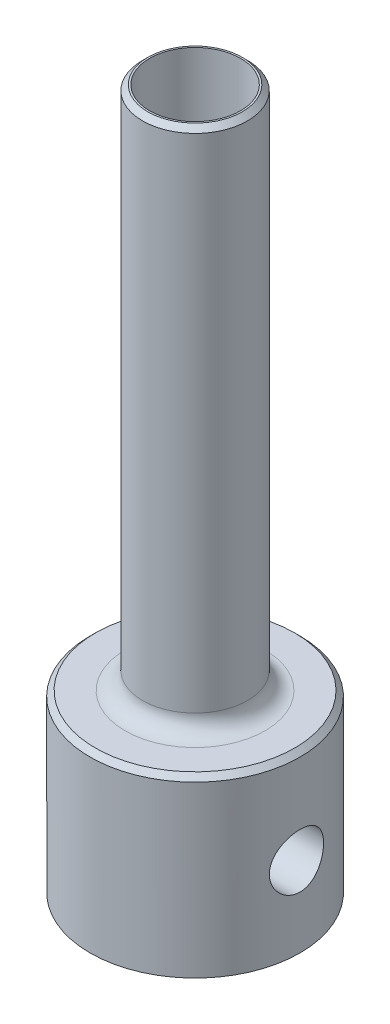
ISO-10303-21;
HEADER;
FILE_DESCRIPTION(('STEP AP214'),'2;1');
FILE_NAME('part.step','',(''),(''),'','','');
FILE_SCHEMA(('AUTOMOTIVE_DESIGN { 1 0 10303 214 1 1 1 1 }'));
ENDSEC;
DATA;
#1=APPLICATION_CONTEXT('core data for automotive mechanical design processes');
#2=APPLICATION_PROTOCOL_DEFINITION('international standard','automotive_design',2000,#1);
#3=PRODUCT_CONTEXT('',#1,'mechanical');
#4=PRODUCT('Part','Part','',(#3));
#5=PRODUCT_RELATED_PRODUCT_CATEGORY('part','',(#4));
#6=PRODUCT_DEFINITION_FORMATION('','',#4);
#7=PRODUCT_DEFINITION_CONTEXT('part definition',#1,'design');
#8=PRODUCT_DEFINITION('design','',#6,#7);
#9=PRODUCT_DEFINITION_SHAPE('','',#8);
#10=(LENGTH_UNIT() NAMED_UNIT(*) SI_UNIT(.MILLI.,.METRE.));
#11=(NAMED_UNIT(*) PLANE_ANGLE_UNIT() SI_UNIT($,.RADIAN.));
#12=(NAMED_UNIT(*) SI_UNIT($,.STERADIAN.) SOLID_ANGLE_UNIT());
#13=UNCERTAINTY_MEASURE_WITH_UNIT(LENGTH_MEASURE(1.E-05),#10,'distance_accuracy_value','');
#14=(GEOMETRIC_REPRESENTATION_CONTEXT(3) GLOBAL_UNCERTAINTY_ASSIGNED_CONTEXT((#13)) GLOBAL_UNIT_ASSIGNED_CONTEXT((#10,
#11,#12)) REPRESENTATION_CONTEXT('',''));
#15=CARTESIAN_POINT('',(0.,0.,0.));
#16=DIRECTION('',(0.,0.,1.));
#17=DIRECTION('',(1.,0.,0.));
#18=AXIS2_PLACEMENT_3D('',#15,#16,#17);
#19=CARTESIAN_POINT('',(6.,4.56706046867482,0.));
#20=DIRECTION('',(-1.,0.,0.));
#21=DIRECTION('',(0.,0.,1.));
#22=AXIS2_PLACEMENT_3D('',#19,#20,#21);
#23=CYLINDRICAL_SURFACE('',#22,1.55);
#24=CARTESIAN_POINT('',(2.08746257451481,4.56706046867482,1.55));
#25=CARTESIAN_POINT('',(2.08745806530159,4.64517581261313,1.55000318983942));
#26=CARTESIAN_POINT('',(2.09191273201824,4.72327534359271,1.54405895301082));
#27=CARTESIAN_POINT('',(2.1089405749611,4.87685905117993,1.52071371002282));
#28=CARTESIAN_POINT('',(2.12152214035706,4.95234044021821,1.50330086477498));
#29=CARTESIAN_POINT('',(2.15278493454552,5.09813246542977,1.45816823322694));
#30=CARTESIAN_POINT('',(2.17142267546406,5.16847571210937,1.43052174081689));
#31=CARTESIAN_POINT('',(2.21261714468958,5.30348121435537,1.36593939264584));
#32=CARTESIAN_POINT('',(2.23517507046234,5.36814172495066,1.32900069692648));
#33=CARTESIAN_POINT('',(2.28495532031077,5.49849954526781,1.24169043633872));
#34=CARTESIAN_POINT('',(2.31241213534774,5.56338248241716,1.19023643904052));
#35=CARTESIAN_POINT('',(2.36701387939925,5.68427289170583,1.07757576447372));
#36=CARTESIAN_POINT('',(2.39415856368944,5.74027378864133,1.01636192878333));
#37=CARTESIAN_POINT('',(2.44849706108598,5.84768812727782,0.878035332538123));
#38=CARTESIAN_POINT('',(2.47539022808828,5.8979836034672,0.799924647925211));
#39=CARTESIAN_POINT('',(2.52286864368294,5.98433524287479,0.634442213538337));
#40=CARTESIAN_POINT('',(2.5434595955574,6.0204042890956,0.547078934003073));
#41=CARTESIAN_POINT('',(2.57426922435814,6.07364120240378,0.374293501243633));
#42=CARTESIAN_POINT('',(2.58528419446998,6.09227311702322,0.289468077507183));
#43=CARTESIAN_POINT('',(2.5987854524458,6.11505105033185,0.11725288413592));
#44=CARTESIAN_POINT('',(2.60127961711166,6.11921044776936,0.0298655582028385));
#45=CARTESIAN_POINT('',(2.59769891031333,6.11319705048243,-0.133452683297385));
#46=CARTESIAN_POINT('',(2.59263599679387,6.10471699545807,-0.209476054323791));
#47=CARTESIAN_POINT('',(2.57622032330329,6.07687431216239,-0.358788270076783));
#48=CARTESIAN_POINT('',(2.56486709802934,6.05751087883139,-0.432076912083671));
#49=CARTESIAN_POINT('',(2.53676589486469,6.00861605985175,-0.574571536689056));
#50=CARTESIAN_POINT('',(2.51998461378551,5.97902182519784,-0.643749111781435));
#51=CARTESIAN_POINT('',(2.48237632002971,5.91075056165637,-0.776245638879004));
#52=CARTESIAN_POINT('',(2.46154823721762,5.87207112971454,-0.839563034666581));
#53=CARTESIAN_POINT('',(2.41470656143321,5.78154986314299,-0.966592034038011));
#54=CARTESIAN_POINT('',(2.38837092798848,5.7286909339586,-1.02945941506711));
#55=CARTESIAN_POINT('',(2.33471287452645,5.61394094799711,-1.14596684937295));
#56=CARTESIAN_POINT('',(2.30738917365759,5.55203782634899,-1.19959436518265));
#57=CARTESIAN_POINT('',(2.2512065830306,5.41261429109983,-1.30225354860711));
#58=CARTESIAN_POINT('',(2.22252618133082,5.33411851954438,-1.35007008223513));
#59=CARTESIAN_POINT('',(2.17093652653093,5.16840102430859,-1.43156349865217));
#60=CARTESIAN_POINT('',(2.14801670542844,5.08119569563776,-1.46526635035277));
#61=CARTESIAN_POINT('',(2.11644259300121,4.92245710350699,-1.51037550701403));
#62=CARTESIAN_POINT('',(2.1056684460474,4.85232371456737,-1.52522252544559));
#63=CARTESIAN_POINT('',(2.09115774059389,4.70999120665968,-1.54506246807911));
#64=CARTESIAN_POINT('',(2.08741320391957,4.63779452403593,-1.55006656370072));
#65=CARTESIAN_POINT('',(2.08751302036696,4.49332796578692,-1.54993198810319));
#66=CARTESIAN_POINT('',(2.09136697020823,4.42105811297075,-1.54478049059661));
#67=CARTESIAN_POINT('',(2.10610081306986,4.27862547032371,-1.52462730206621));
#68=CARTESIAN_POINT('',(2.11698620673201,4.20846437516587,-1.50961789912821));
#69=CARTESIAN_POINT('',(2.14434666184983,4.07186628230976,-1.47048984579238));
#70=CARTESIAN_POINT('',(2.16082634018672,4.00543241357685,-1.44636366958811));
#71=CARTESIAN_POINT('',(2.1976010774662,3.87733343636671,-1.38985043554067));
#72=CARTESIAN_POINT('',(2.21789759032559,3.8156701577879,-1.35746022806218));
#73=CARTESIAN_POINT('',(2.2643882102968,3.68719851226779,-1.27866735172455));
#74=CARTESIAN_POINT('',(2.29098832191621,3.62143677180769,-1.23079544073045));
#75=CARTESIAN_POINT('',(2.34454000954113,3.49820584473131,-1.12544671730584));
#76=CARTESIAN_POINT('',(2.37149189417325,3.44074456021763,-1.06796086318064));
#77=CARTESIAN_POINT('',(2.42671007046372,3.32847134803819,-0.936366294995754));
#78=CARTESIAN_POINT('',(2.45471577789731,3.27490021136597,-0.861076411110007));
#79=CARTESIAN_POINT('',(2.50519003473271,3.18141086155145,-0.700760441538226));
#80=CARTESIAN_POINT('',(2.52766237852491,3.14148328529197,-0.615741086564795));
#81=CARTESIAN_POINT('',(2.56303350772786,3.07970294229233,-0.444853565643398));
#82=CARTESIAN_POINT('',(2.57651901048577,3.05672868805645,-0.359516648655455));
#83=CARTESIAN_POINT('',(2.59486088471308,3.02564356958777,-0.185304462903781));
#84=CARTESIAN_POINT('',(2.59972671492911,3.01751641267397,-0.0964331822275583));
#85=CARTESIAN_POINT('',(2.60021701940269,3.0166985822596,0.0696974031075937));
#86=CARTESIAN_POINT('',(2.59696906461994,3.02212443813912,0.146952088376935));
#87=CARTESIAN_POINT('',(2.5838528722841,3.04427487857837,0.299236278104113));
#88=CARTESIAN_POINT('',(2.57398451620059,3.06099966543208,0.374265742696901));
#89=CARTESIAN_POINT('',(2.5486936517609,3.10464830952694,0.519137376139522));
#90=CARTESIAN_POINT('',(2.53334736693584,3.13143244867627,0.58903559661503));
#91=CARTESIAN_POINT('',(2.49831176992408,3.19420247854654,0.723369193616868));
#92=CARTESIAN_POINT('',(2.47862146061034,3.23019048222429,0.787803311204854));
#93=CARTESIAN_POINT('',(2.43400282482893,3.31474298831213,0.916946595240061));
#94=CARTESIAN_POINT('',(2.4087375171319,3.36425064518812,0.980920521598723));
#95=CARTESIAN_POINT('',(2.35667183778524,3.47223535145437,1.10015460920547));
#96=CARTESIAN_POINT('',(2.32986975464286,3.5307225277728,1.1554047874702));
#97=CARTESIAN_POINT('',(2.27372679196635,3.66351382732411,1.26264140573439));
#98=CARTESIAN_POINT('',(2.2444831335369,3.73887992854266,1.31337393335238));
#99=CARTESIAN_POINT('',(2.1905945675124,3.898606701965,1.4014162561131));
#100=CARTESIAN_POINT('',(2.16594645345186,3.98296103770681,1.43873542719969));
#101=CARTESIAN_POINT('',(2.12743359305814,4.14956134641682,1.49501637264561));
#102=CARTESIAN_POINT('',(2.11270187909245,4.23108050794286,1.51550636106639));
#103=CARTESIAN_POINT('',(2.09272806757731,4.3974306736217,1.54298328014767));
#104=CARTESIAN_POINT('',(2.08746746992226,4.48225488993317,1.5499965369649));
#105=CARTESIAN_POINT('',(2.08746257451481,4.56706046867482,1.55));
#106=B_SPLINE_CURVE_WITH_KNOTS('',3,(#24,#25,#26,#27,#28,#29,#30,#31,#32,#33,#34,#35,#36,#37,
#38,#39,#40,#41,#42,#43,#44,#45,#46,#47,#48,#49,#50,#51,#52,#53,#54,#55,#56,#57,#58,#59,#60,#61,
#62,#63,#64,#65,#66,#67,#68,#69,#70,#71,#72,#73,#74,#75,#76,#77,#78,#79,#80,#81,#82,#83,#84,#85,
#86,#87,#88,#89,#90,#91,#92,#93,#94,#95,#96,#97,#98,#99,#100,#101,#102,#103,#104,#105),
.UNSPECIFIED.,.T.,.F.,(4,2,2,2,2,2,2,2,2,2,2,2,2,2,2,2,2,2,2,2,2,2,2,2,2,2,2,2,2,2,2,2,2,2,2,2,
2,2,2,2,4),(0.,0.233990659873545,0.46822324859307,0.700809725276847,0.933467373469937,
1.19416698638042,1.45505869839772,1.74364404936739,2.03196746329298,2.29304451254287,
2.55388015157855,2.78277394347685,3.01168466921828,3.2420273712693,3.47243106820668,
3.73016624596823,3.98824843363916,4.27566389977332,4.5625481781735,4.7790925036228,
4.99539091567404,5.21196268280878,5.42870407780935,5.64562478293819,5.86262828595975,
6.11837069555862,6.37435499176225,6.6625142736021,6.95047540237001,7.21706594026688,
7.4833637549748,7.71476131793424,7.94616302390282,8.17446291585915,8.40281526637836,
8.65605269430457,8.90957784534476,9.19453536427606,9.47929330857837,9.73382195394626,
9.98785288218989),.UNSPECIFIED.);
#107=CARTESIAN_POINT('',(2.08746257451481,4.56706046867482,1.55));
#108=VERTEX_POINT('',#107);
#109=EDGE_CURVE('E110',#108,#108,#106,.T.);
#110=ORIENTED_EDGE('',*,*,#109,.T.);
#111=EDGE_LOOP('',(#110));
#112=FACE_BOUND('',#111,.T.);
#113=CARTESIAN_POINT('',(6.,3.01706046867483,0.));
#114=CARTESIAN_POINT('',(5.99999862342204,3.01706269335949,0.0855443503109015));
#115=CARTESIAN_POINT('',(5.99815242347884,3.02416603052848,0.171113037497965));
#116=CARTESIAN_POINT('',(5.99096665435731,3.05234534120872,0.33979179851728));
#117=CARTESIAN_POINT('',(5.98562525272891,3.07342864415661,0.422900558766312));
#118=CARTESIAN_POINT('',(5.97203960949649,3.12884151795694,0.584199755325658));
#119=CARTESIAN_POINT('',(5.9637989820615,3.16315460167539,0.662396172966988));
#120=CARTESIAN_POINT('',(5.94528918762444,3.24399346589979,0.811923659298572));
#121=CARTESIAN_POINT('',(5.93501991895733,3.29051985851235,0.88325438364906));
#122=CARTESIAN_POINT('',(5.91331349844705,3.39553949278338,1.01858610262265));
#123=CARTESIAN_POINT('',(5.90185736103427,3.45424994282367,1.08241550098619));
#124=CARTESIAN_POINT('',(5.87919241575865,3.58150643133549,1.19944035779268));
#125=CARTESIAN_POINT('',(5.86798363784996,3.65005365353798,1.25263453457501));
#126=CARTESIAN_POINT('',(5.84688974016224,3.7963886240304,1.34770055669256));
#127=CARTESIAN_POINT('',(5.83702865054471,3.87430659800901,1.38937776494719));
#128=CARTESIAN_POINT('',(5.82002464160501,4.03633918729534,1.45897413633046));
#129=CARTESIAN_POINT('',(5.81288125518578,4.12045273478852,1.48689566391888));
#130=CARTESIAN_POINT('',(5.80231702371196,4.29059517657796,1.52759748721533));
#131=CARTESIAN_POINT('',(5.7988201353963,4.37654512214238,1.54068759900813));
#132=CARTESIAN_POINT('',(5.79571741886674,4.54948675360122,1.55232047459679));
#133=CARTESIAN_POINT('',(5.79611091167847,4.63647825506971,1.55086577684598));
#134=CARTESIAN_POINT('',(5.80067628829122,4.80663776835577,1.53369691054171));
#135=CARTESIAN_POINT('',(5.80474960405351,4.88984637285412,1.51835471262771));
#136=CARTESIAN_POINT('',(5.81605821715439,5.05246662296708,1.47444090299209));
#137=CARTESIAN_POINT('',(5.82329375330479,5.13187798130994,1.44586829209606));
#138=CARTESIAN_POINT('',(5.84020013851927,5.28563323106378,1.3759946091883));
#139=CARTESIAN_POINT('',(5.84989618026752,5.35991391784646,1.33456080927768));
#140=CARTESIAN_POINT('',(5.87061719128373,5.50060028114337,1.24023361109786));
#141=CARTESIAN_POINT('',(5.88164240732856,5.5670044907426,1.18733808336582));
#142=CARTESIAN_POINT('',(5.90419219977471,5.69218143532656,1.06967440562533));
#143=CARTESIAN_POINT('',(5.91572174563884,5.7506593131412,1.0045931064851));
#144=CARTESIAN_POINT('',(5.93767843378634,5.85592917969273,0.865408013055353));
#145=CARTESIAN_POINT('',(5.94810553774123,5.90272076221032,0.791303905263335));
#146=CARTESIAN_POINT('',(5.9667402594753,5.98340861269976,0.635738370807675));
#147=CARTESIAN_POINT('',(5.97493913584994,6.01725429906115,0.554249593476176));
#148=CARTESIAN_POINT('',(5.98813025256303,6.0706826765574,0.386479280110456));
#149=CARTESIAN_POINT('',(5.99312314913482,6.0902682867032,0.300198728837418));
#150=CARTESIAN_POINT('',(5.99924157949929,6.11416401587934,0.127812754543027));
#151=CARTESIAN_POINT('',(6.00046866382196,6.11887534436704,0.0417664674608003));
#152=CARTESIAN_POINT('',(5.99920778898859,6.11399291602338,-0.129885864978109));
#153=CARTESIAN_POINT('',(5.99672018852505,6.10440054036766,-0.215491952039898));
#154=CARTESIAN_POINT('',(5.9883747898563,6.07151293542675,-0.382421044317187));
#155=CARTESIAN_POINT('',(5.98257145129857,6.04843899995326,-0.463790618710361));
#156=CARTESIAN_POINT('',(5.96825062497589,5.98949809840499,-0.621498146324932));
#157=CARTESIAN_POINT('',(5.95973285281969,5.9536297918168,-0.697835571316156));
#158=CARTESIAN_POINT('',(5.94068733069941,5.86935725083693,-0.844889791044561));
#159=CARTESIAN_POINT('',(5.93012502400678,5.82073147673446,-0.915475042399402));
#160=CARTESIAN_POINT('',(5.90821252780639,5.71260516322405,-1.04762556972084));
#161=CARTESIAN_POINT('',(5.89686219287224,5.65310261323924,-1.10918917423502));
#162=CARTESIAN_POINT('',(5.87428332425334,5.52304406222288,-1.2232207057171));
#163=CARTESIAN_POINT('',(5.86306587289093,5.45223820398516,-1.27540635258126));
#164=CARTESIAN_POINT('',(5.84235399256743,5.30264003275595,-1.36715789008128));
#165=CARTESIAN_POINT('',(5.83285948883467,5.22384806657319,-1.40672432841608));
#166=CARTESIAN_POINT('',(5.81677568825163,5.06092490657044,-1.47181700201492));
#167=CARTESIAN_POINT('',(5.81016933744992,4.97682850474033,-1.49742588163859));
#168=CARTESIAN_POINT('',(5.80059922484275,4.80532528466651,-1.53408420816176));
#169=CARTESIAN_POINT('',(5.797634601187,4.71791925472808,-1.54513709992256));
#170=CARTESIAN_POINT('',(5.79575243316189,4.54515886533264,-1.55218064333914));
#171=CARTESIAN_POINT('',(5.79671333306591,4.45982398861433,-1.54862367749458));
#172=CARTESIAN_POINT('',(5.80229114732773,4.2910151869065,-1.52759073165751));
#173=CARTESIAN_POINT('',(5.80690797832574,4.20754121953054,-1.51011506902865));
#174=CARTESIAN_POINT('',(5.81920740859555,4.04535377128296,-1.46199548278988));
#175=CARTESIAN_POINT('',(5.82686896487795,3.96661179947207,-1.43144183551097));
#176=CARTESIAN_POINT('',(5.84439629140871,3.81531363478547,-1.35810424265096));
#177=CARTESIAN_POINT('',(5.85426238745081,3.74275835839073,-1.31531848910968));
#178=CARTESIAN_POINT('',(5.87542905575269,3.60372020392646,-1.21733627257171));
#179=CARTESIAN_POINT('',(5.88676182878523,3.53746161101297,-1.16182845549743));
#180=CARTESIAN_POINT('',(5.90939893254818,3.41505241599583,-1.04057734031479));
#181=CARTESIAN_POINT('',(5.92070325579735,3.35890424431844,-0.974831588191549));
#182=CARTESIAN_POINT('',(5.94227581799358,3.25722668568332,-0.83340766230772));
#183=CARTESIAN_POINT('',(5.95251925728993,3.21192829401003,-0.757559326709036));
#184=CARTESIAN_POINT('',(5.97054968326495,3.13479727462353,-0.599064081298706));
#185=CARTESIAN_POINT('',(5.97833833939723,3.10295549026978,-0.516421840334346));
#186=CARTESIAN_POINT('',(5.98950082579933,3.05808722216383,-0.361669629335356));
#187=CARTESIAN_POINT('',(5.99341016806927,3.04273664920321,-0.290263292208832));
#188=CARTESIAN_POINT('',(5.99866023146264,3.02222276303871,-0.14591044952007));
#189=CARTESIAN_POINT('',(6.00000117413646,3.01705857115543,-0.0729640773502671));
#190=CARTESIAN_POINT('',(6.,3.01706046867483,0.));
#191=B_SPLINE_CURVE_WITH_KNOTS('',3,(#113,#114,#115,#116,#117,#118,#119,#120,#121,#122,#123,
#124,#125,#126,#127,#128,#129,#130,#131,#132,#133,#134,#135,#136,#137,#138,#139,#140,#141,#142,
#143,#144,#145,#146,#147,#148,#149,#150,#151,#152,#153,#154,#155,#156,#157,#158,#159,#160,#161,
#162,#163,#164,#165,#166,#167,#168,#169,#170,#171,#172,#173,#174,#175,#176,#177,#178,#179,#180,
#181,#182,#183,#184,#185,#186,#187,#188,#189,#190),.UNSPECIFIED.,.T.,.F.,(4,2,2,2,2,2,2,2,2,2,2,
2,2,2,2,2,2,2,2,2,2,2,2,2,2,2,2,2,2,2,2,2,2,2,2,2,2,2,4),(0.,0.256365570724542,
0.512865655545689,0.769047114279867,1.02524141476863,1.28647055705641,1.54773116136504,
1.8131691684351,2.07856153351339,2.33830150604632,2.59799614788668,2.85093436268057,
3.10389168274485,3.35955156797635,3.61525899278828,3.87877259974276,4.14229536523848,
4.40683748579118,4.67132543983077,4.92861548131817,5.18588068030858,5.43903711917566,
5.69222008997017,5.95012990802178,6.20808744911762,6.47283932841185,6.73757971537994,
7.00073502574155,7.26382804582371,7.51883699534657,7.77384013051372,8.02711068846515,
8.28041870031189,8.54075360158112,8.8011510009926,9.066678527123,9.33202508117175,
9.55070803349451,9.76937212135429),.UNSPECIFIED.);
#192=CARTESIAN_POINT('',(6.,3.01706046867483,0.));
#193=VERTEX_POINT('',#192);
#194=EDGE_CURVE('E49',#193,#193,#191,.T.);
#195=ORIENTED_EDGE('',*,*,#194,.F.);
#196=EDGE_LOOP('',(#195));
#197=FACE_BOUND('',#196,.T.);
#198=ADVANCED_FACE('F39',(#112,#197),#23,.F.);
#199=CARTESIAN_POINT('',(0.,10.,0.));
#200=DIRECTION('',(0.,-1.,0.));
#201=DIRECTION('',(0.,0.,-1.));
#202=AXIS2_PLACEMENT_3D('',#199,#200,#201);
#203=CYLINDRICAL_SURFACE('',#202,6.);
#204=CARTESIAN_POINT('',(-5.79633504897707,4.56706046867482,1.55));
#205=CARTESIAN_POINT('',(-5.79633661604596,4.48156983431237,1.54999774561704));
#206=CARTESIAN_POINT('',(-5.79824707702891,4.39605480299505,1.54290301936433));
#207=CARTESIAN_POINT('',(-5.80566134638855,4.2274873308546,1.51476100618114));
#208=CARTESIAN_POINT('',(-5.8111671031582,4.14443625084438,1.49370615376646));
#209=CARTESIAN_POINT('',(-5.82510772314797,3.98325941474512,1.43837641408219));
#210=CARTESIAN_POINT('',(-5.83353863803459,3.90512718637286,1.40411934009938));
#211=CARTESIAN_POINT('',(-5.85237464979213,3.75570852038625,1.3234126266569));
#212=CARTESIAN_POINT('',(-5.86277986502739,3.68442249360529,1.27696225611394));
#213=CARTESIAN_POINT('',(-5.88466575958071,3.54904567285877,1.17202166514603));
#214=CARTESIAN_POINT('',(-5.89616455979493,3.48513941760034,1.11329711501732));
#215=CARTESIAN_POINT('',(-5.9187851954122,3.36796470303511,0.985979494210385));
#216=CARTESIAN_POINT('',(-5.92990699362712,3.31469729064112,0.91738545346877));
#217=CARTESIAN_POINT('',(-5.95072183741225,3.21955017097682,0.771004170994655));
#218=CARTESIAN_POINT('',(-5.96039100922924,3.1778528227615,0.693094707718739));
#219=CARTESIAN_POINT('',(-5.97700382998799,3.10821693115633,0.531080303294779));
#220=CARTESIAN_POINT('',(-5.98394790920881,3.08027621548261,0.446976342720887));
#221=CARTESIAN_POINT('',(-5.99420001835036,3.03954084498164,0.276885367103386));
#222=CARTESIAN_POINT('',(-5.99758323349779,3.02643254594783,0.190978077833732));
#223=CARTESIAN_POINT('',(-6.00059484994249,3.01474847585754,0.0181216103858169));
#224=CARTESIAN_POINT('',(-6.00022384247458,3.01617041650243,-0.0688274015822508));
#225=CARTESIAN_POINT('',(-5.99582435082941,3.033283201017,-0.239120018995549));
#226=CARTESIAN_POINT('',(-5.99188268833877,3.04863534197716,-0.322500243828173));
#227=CARTESIAN_POINT('',(-5.98088653424113,3.09262695253149,-0.485458383908401));
#228=CARTESIAN_POINT('',(-5.97383187088469,3.1212671552546,-0.565036089096163));
#229=CARTESIAN_POINT('',(-5.95727155620565,3.19128879077629,-0.719008949169404));
#230=CARTESIAN_POINT('',(-5.9477432833266,3.23278854284426,-0.793347763471506));
#231=CARTESIAN_POINT('',(-5.92726592189155,3.32726098502575,-0.934123330338746));
#232=CARTESIAN_POINT('',(-5.91631657148661,3.3802357907487,-1.00055862225958));
#233=CARTESIAN_POINT('',(-5.8938141920939,3.49796162265742,-1.12566219320472));
#234=CARTESIAN_POINT('',(-5.88225286056917,3.56300836240708,-1.18405101619255));
#235=CARTESIAN_POINT('',(-5.86011668744095,3.70209074540949,-1.2891569008143));
#236=CARTESIAN_POINT('',(-5.84954189862138,3.77612686914257,-1.33587333815367));
#237=CARTESIAN_POINT('',(-5.83054459100921,3.93166294634892,-1.41650376820232));
#238=CARTESIAN_POINT('',(-5.82213417930304,4.0132015638488,-1.45034622947371));
#239=CARTESIAN_POINT('',(-5.80857065445023,4.18108166831384,-1.50375347937329));
#240=CARTESIAN_POINT('',(-5.80341679026275,4.26742204287316,-1.52332156018949));
#241=CARTESIAN_POINT('',(-5.79710871209302,4.43985232645764,-1.54715203869978));
#242=CARTESIAN_POINT('',(-5.79584608247047,4.52588098042778,-1.55182943874833));
#243=CARTESIAN_POINT('',(-5.79716757577838,4.69749041130443,-1.54688551372432));
#244=CARTESIAN_POINT('',(-5.79975131765827,4.78307123173387,-1.53726560505113));
#245=CARTESIAN_POINT('',(-5.80837012988762,4.94978623769763,-1.50436500739166));
#246=CARTESIAN_POINT('',(-5.81434313484917,5.03097238382434,-1.48132978966476));
#247=CARTESIAN_POINT('',(-5.82900769773326,5.18832992253658,-1.42252650790292));
#248=CARTESIAN_POINT('',(-5.83769959419064,5.26450068921632,-1.38675685820062));
#249=CARTESIAN_POINT('',(-5.85704801458277,5.41141277097232,-1.30264435155056));
#250=CARTESIAN_POINT('',(-5.86774162733935,5.48200827920484,-1.25405555077342));
#251=CARTESIAN_POINT('',(-5.88979944116253,5.61419623922951,-1.14599195327321));
#252=CARTESIAN_POINT('',(-5.90116375999625,5.67578710328382,-1.0865152409002));
#253=CARTESIAN_POINT('',(-5.92365280797419,5.78991900786445,-0.95645214765174));
#254=CARTESIAN_POINT('',(-5.93476285317968,5.84217181316605,-0.885609809309284));
#255=CARTESIAN_POINT('',(-5.95517624565337,5.93404143363754,-0.735916702503082));
#256=CARTESIAN_POINT('',(-5.96447968846628,5.97365891711539,-0.657066357890073));
#257=CARTESIAN_POINT('',(-5.98017214809089,6.03877879917867,-0.494147340531283));
#258=CARTESIAN_POINT('',(-5.98658251474297,6.06438490533112,-0.410122275100361));
#259=CARTESIAN_POINT('',(-5.99586027253599,6.10106167396062,-0.238772827357832));
#260=CARTESIAN_POINT('',(-5.99872839709067,6.11213534537728,-0.151449131880656));
#261=CARTESIAN_POINT('',(-6.0005662563181,6.1192541134843,0.0213184512426026));
#262=CARTESIAN_POINT('',(-5.99964600070264,6.11572329156284,0.106743950449606));
#263=CARTESIAN_POINT('',(-5.9942568314865,6.09471121039962,0.275741150189934));
#264=CARTESIAN_POINT('',(-5.98978803677726,6.07723041854214,0.359312912735035));
#265=CARTESIAN_POINT('',(-5.97782332609427,6.02904828876953,0.521753732814644));
#266=CARTESIAN_POINT('',(-5.97034604660067,5.99842826738099,0.600648372829212));
#267=CARTESIAN_POINT('',(-5.95314895439004,5.92490995013071,0.752225222417623));
#268=CARTESIAN_POINT('',(-5.94342884278627,5.88201001762666,0.824906602222466));
#269=CARTESIAN_POINT('',(-5.92248299280681,5.78388200990006,0.963986818519657));
#270=CARTESIAN_POINT('',(-5.91122537503475,5.72836940445855,1.03018009771606));
#271=CARTESIAN_POINT('',(-5.8886094646594,5.6071379688479,1.15245541020698));
#272=CARTESIAN_POINT('',(-5.87725114682509,5.54141650849661,1.20853482972478));
#273=CARTESIAN_POINT('',(-5.85545616778492,5.40002913740143,1.31011171849257));
#274=CARTESIAN_POINT('',(-5.84504286520679,5.32418860408098,1.35537155873463));
#275=CARTESIAN_POINT('',(-5.82663861972953,5.16571575094926,1.43243247625023));
#276=CARTESIAN_POINT('',(-5.81864600217376,5.08308817702483,1.4642428640644));
#277=CARTESIAN_POINT('',(-5.8071690500245,4.92841194918234,1.50904592757997));
#278=CARTESIAN_POINT('',(-5.80313798897001,4.85707017869522,1.52436897573479));
#279=CARTESIAN_POINT('',(-5.79772045079217,4.71284490662728,1.54484647137972));
#280=CARTESIAN_POINT('',(-5.79633371267831,4.6399615579158,1.55000192239741));
#281=CARTESIAN_POINT('',(-5.79633504897707,4.56706046867482,1.55));
#282=B_SPLINE_CURVE_WITH_KNOTS('',3,(#204,#205,#206,#207,#208,#209,#210,#211,#212,#213,#214,
#215,#216,#217,#218,#219,#220,#221,#222,#223,#224,#225,#226,#227,#228,#229,#230,#231,#232,#233,
#234,#235,#236,#237,#238,#239,#240,#241,#242,#243,#244,#245,#246,#247,#248,#249,#250,#251,#252,
#253,#254,#255,#256,#257,#258,#259,#260,#261,#262,#263,#264,#265,#266,#267,#268,#269,#270,#271,
#272,#273,#274,#275,#276,#277,#278,#279,#280,#281),.UNSPECIFIED.,.T.,.F.,(4,2,2,2,2,2,2,2,2,2,2,
2,2,2,2,2,2,2,2,2,2,2,2,2,2,2,2,2,2,2,2,2,2,2,2,2,2,2,4),(0.,0.25620401635374,0.512546992300906,
0.768545297943091,1.0245589561888,1.28599912627693,1.54746501066115,1.81284398870782,
2.07818104781024,2.337795861759,2.59736979083056,2.8507966844607,3.10423756182242,
3.36008326763613,3.6159761829001,3.87925342032546,4.14254473605325,4.40727831724801,
4.67195082199025,4.92917925091306,5.18638219854379,5.43902050038028,5.6916902712686,
5.94961321433791,6.20758158079008,6.47249403663949,6.73739247840392,7.00030275331392,
7.26315858407671,7.51843606806669,7.77370499951663,8.02741639647247,8.2811616233391,
8.54132880352907,8.80156312401177,9.0670742435755,9.33240125781846,9.55089765478421,
9.76937248538278),.UNSPECIFIED.);
#283=CARTESIAN_POINT('',(-5.79633504897707,4.56706046867482,1.55));
#284=VERTEX_POINT('',#283);
#285=EDGE_CURVE('E99',#284,#284,#282,.T.);
#286=ORIENTED_EDGE('',*,*,#285,.T.);
#287=EDGE_LOOP('',(#286));
#288=FACE_BOUND('',#287,.T.);
#289=ORIENTED_EDGE('',*,*,#194,.T.);
#290=EDGE_LOOP('',(#289));
#291=FACE_BOUND('',#290,.T.);
#292=CARTESIAN_POINT('',(0.,9.7,0.));
#293=DIRECTION('',(0.,1.,0.));
#294=DIRECTION('',(0.,0.,1.));
#295=AXIS2_PLACEMENT_3D('',#292,#293,#294);
#296=CIRCLE('',#295,6.);
#297=CARTESIAN_POINT('',(0.,9.7,-6.));
#298=VERTEX_POINT('',#297);
#299=EDGE_CURVE('E53',#298,#298,#296,.F.);
#300=ORIENTED_EDGE('',*,*,#299,.T.);
#301=EDGE_LOOP('',(#300));
#302=FACE_BOUND('',#301,.T.);
#303=CARTESIAN_POINT('',(0.,0.,0.));
#304=DIRECTION('',(0.,1.,0.));
#305=DIRECTION('',(0.,0.,1.));
#306=AXIS2_PLACEMENT_3D('',#303,#304,#305);
#307=CIRCLE('',#306,6.);
#308=CARTESIAN_POINT('',(0.,0.,6.));
#309=VERTEX_POINT('',#308);
#310=EDGE_CURVE('E106',#309,#309,#307,.T.);
#311=ORIENTED_EDGE('',*,*,#310,.T.);
#312=EDGE_LOOP('',(#311));
#313=FACE_BOUND('',#312,.T.);
#314=ADVANCED_FACE('F83',(#288,#291,#302,#313),#203,.T.);
#315=CARTESIAN_POINT('',(0.,10.,0.));
#316=DIRECTION('',(0.,1.,0.));
#317=DIRECTION('',(0.,0.,1.));
#318=AXIS2_PLACEMENT_3D('',#315,#316,#317);
#319=PLANE('',#318);
#320=CARTESIAN_POINT('',(0.,10.,0.));
#321=DIRECTION('',(0.,1.,0.));
#322=DIRECTION('',(0.,0.,1.));
#323=AXIS2_PLACEMENT_3D('',#320,#321,#322);
#324=CIRCLE('',#323,4.);
#325=CARTESIAN_POINT('',(0.,10.,4.));
#326=VERTEX_POINT('',#325);
#327=EDGE_CURVE('E10',#326,#326,#324,.F.);
#328=ORIENTED_EDGE('',*,*,#327,.T.);
#329=EDGE_LOOP('',(#328));
#330=FACE_BOUND('',#329,.T.);
#331=CARTESIAN_POINT('',(0.,10.,0.));
#332=DIRECTION('',(0.,1.,0.));
#333=DIRECTION('',(0.,0.,1.));
#334=AXIS2_PLACEMENT_3D('',#331,#332,#333);
#335=CIRCLE('',#334,5.7);
#336=CARTESIAN_POINT('',(0.,10.,-5.7));
#337=VERTEX_POINT('',#336);
#338=EDGE_CURVE('E141',#337,#337,#335,.T.);
#339=ORIENTED_EDGE('',*,*,#338,.T.);
#340=EDGE_LOOP('',(#339));
#341=FACE_BOUND('',#340,.T.);
#342=ADVANCED_FACE('F85',(#330,#341),#319,.T.);
#343=CARTESIAN_POINT('',(0.,0.,0.));
#344=DIRECTION('',(0.,1.,0.));
#345=DIRECTION('',(0.,0.,1.));
#346=AXIS2_PLACEMENT_3D('',#343,#344,#345);
#347=PLANE('',#346);
#348=CARTESIAN_POINT('',(0.,0.,0.));
#349=DIRECTION('',(0.,1.,0.));
#350=DIRECTION('',(0.,0.,1.));
#351=AXIS2_PLACEMENT_3D('',#348,#349,#350);
#352=CIRCLE('',#351,2.6);
#353=CARTESIAN_POINT('',(0.,0.,2.6));
#354=VERTEX_POINT('',#353);
#355=EDGE_CURVE('E113',#354,#354,#352,.T.);
#356=ORIENTED_EDGE('',*,*,#355,.T.);
#357=EDGE_LOOP('',(#356));
#358=FACE_BOUND('',#357,.T.);
#359=ORIENTED_EDGE('',*,*,#310,.F.);
#360=EDGE_LOOP('',(#359));
#361=FACE_BOUND('',#360,.T.);
#362=ADVANCED_FACE('F82',(#358,#361),#347,.F.);
#363=CARTESIAN_POINT('',(0.,40.,0.));
#364=DIRECTION('',(0.,-1.,0.));
#365=DIRECTION('',(0.,0.,-1.));
#366=AXIS2_PLACEMENT_3D('',#363,#364,#365);
#367=CYLINDRICAL_SURFACE('',#366,3.);
#368=CARTESIAN_POINT('',(0.,11.,0.));
#369=DIRECTION('',(0.,1.,0.));
#370=DIRECTION('',(0.,0.,1.));
#371=AXIS2_PLACEMENT_3D('',#368,#369,#370);
#372=CIRCLE('',#371,3.);
#373=CARTESIAN_POINT('',(0.,11.,3.));
#374=VERTEX_POINT('',#373);
#375=EDGE_CURVE('E46',#374,#374,#372,.T.);
#376=ORIENTED_EDGE('',*,*,#375,.T.);
#377=EDGE_LOOP('',(#376));
#378=FACE_BOUND('',#377,.T.);
#379=CARTESIAN_POINT('',(0.,39.7,0.));
#380=DIRECTION('',(0.,1.,0.));
#381=DIRECTION('',(0.,0.,1.));
#382=AXIS2_PLACEMENT_3D('',#379,#380,#381);
#383=CIRCLE('',#382,3.);
#384=CARTESIAN_POINT('',(0.,39.7,3.));
#385=VERTEX_POINT('',#384);
#386=EDGE_CURVE('E136',#385,#385,#383,.F.);
#387=ORIENTED_EDGE('',*,*,#386,.T.);
#388=EDGE_LOOP('',(#387));
#389=FACE_BOUND('',#388,.T.);
#390=ADVANCED_FACE('F75',(#378,#389),#367,.T.);
#391=CARTESIAN_POINT('',(0.,40.,0.));
#392=DIRECTION('',(0.,1.,0.));
#393=DIRECTION('',(0.,0.,1.));
#394=AXIS2_PLACEMENT_3D('',#391,#392,#393);
#395=PLANE('',#394);
#396=CARTESIAN_POINT('',(0.,40.000012,0.));
#397=DIRECTION('',(0.,1.,0.));
#398=DIRECTION('',(0.,0.,1.));
#399=AXIS2_PLACEMENT_3D('',#396,#397,#398);
#400=CIRCLE('',#399,2.6);
#401=CARTESIAN_POINT('',(0.,40.000012,2.6));
#402=VERTEX_POINT('',#401);
#403=EDGE_CURVE('E254',#402,#402,#400,.T.);
#404=ORIENTED_EDGE('',*,*,#403,.F.);
#405=EDGE_LOOP('',(#404));
#406=FACE_BOUND('',#405,.T.);
#407=CARTESIAN_POINT('',(0.,40.,0.));
#408=DIRECTION('',(0.,1.,0.));
#409=DIRECTION('',(0.,0.,1.));
#410=AXIS2_PLACEMENT_3D('',#407,#408,#409);
#411=CIRCLE('',#410,2.7);
#412=CARTESIAN_POINT('',(0.,40.,2.7));
#413=VERTEX_POINT('',#412);
#414=EDGE_CURVE('E139',#413,#413,#411,.T.);
#415=ORIENTED_EDGE('',*,*,#414,.T.);
#416=EDGE_LOOP('',(#415));
#417=FACE_BOUND('',#416,.T.);
#418=ADVANCED_FACE('F64',(#406,#417),#395,.T.);
#419=CARTESIAN_POINT('',(0.,40.,0.));
#420=DIRECTION('',(0.,-1.,0.));
#421=DIRECTION('',(0.,0.,-1.));
#422=AXIS2_PLACEMENT_3D('',#419,#420,#421);
#423=CONICAL_SURFACE('',#422,2.7,0.78539816339745);
#424=ORIENTED_EDGE('',*,*,#386,.F.);
#425=EDGE_LOOP('',(#424));
#426=FACE_BOUND('',#425,.T.);
#427=ORIENTED_EDGE('',*,*,#414,.F.);
#428=EDGE_LOOP('',(#427));
#429=FACE_BOUND('',#428,.T.);
#430=ADVANCED_FACE('F72',(#426,#429),#423,.T.);
#431=CARTESIAN_POINT('',(0.,10.,0.));
#432=DIRECTION('',(0.,-1.,0.));
#433=DIRECTION('',(0.,0.,-1.));
#434=AXIS2_PLACEMENT_3D('',#431,#432,#433);
#435=CONICAL_SURFACE('',#434,5.7,0.785398163397441);
#436=CARTESIAN_POINT('',(0.,9.7,-6.));
#437=CARTESIAN_POINT('',(0.,9.70312499999999,-5.996875));
#438=CARTESIAN_POINT('',(0.,9.70624999999999,-5.99375));
#439=CARTESIAN_POINT('',(0.,9.71249999999999,-5.9875));
#440=CARTESIAN_POINT('',(0.,9.715625,-5.984375));
#441=CARTESIAN_POINT('',(0.,9.72187499999999,-5.978125));
#442=CARTESIAN_POINT('',(0.,9.725,-5.975));
#443=CARTESIAN_POINT('',(0.,9.73125,-5.96875));
#444=CARTESIAN_POINT('',(0.,9.73437499999999,-5.965625));
#445=CARTESIAN_POINT('',(0.,9.74062499999999,-5.959375));
#446=CARTESIAN_POINT('',(0.,9.74375,-5.95625));
#447=CARTESIAN_POINT('',(0.,9.74999999999999,-5.95));
#448=CARTESIAN_POINT('',(0.,9.753125,-5.946875));
#449=CARTESIAN_POINT('',(0.,9.759375,-5.940625));
#450=CARTESIAN_POINT('',(0.,9.7625,-5.9375));
#451=CARTESIAN_POINT('',(0.,9.76874999999999,-5.93125));
#452=CARTESIAN_POINT('',(0.,9.771875,-5.928125));
#453=CARTESIAN_POINT('',(0.,9.778125,-5.921875));
#454=CARTESIAN_POINT('',(0.,9.78125,-5.91875));
#455=CARTESIAN_POINT('',(0.,9.7875,-5.9125));
#456=CARTESIAN_POINT('',(0.,9.790625,-5.909375));
#457=CARTESIAN_POINT('',(0.,9.79687499999999,-5.903125));
#458=CARTESIAN_POINT('',(0.,9.8,-5.9));
#459=CARTESIAN_POINT('',(0.,9.80625,-5.89375));
#460=CARTESIAN_POINT('',(0.,9.809375,-5.890625));
#461=CARTESIAN_POINT('',(0.,9.815625,-5.884375));
#462=CARTESIAN_POINT('',(0.,9.81875,-5.88125));
#463=CARTESIAN_POINT('',(0.,9.825,-5.875));
#464=CARTESIAN_POINT('',(0.,9.828125,-5.871875));
#465=CARTESIAN_POINT('',(0.,9.834375,-5.865625));
#466=CARTESIAN_POINT('',(0.,9.8375,-5.8625));
#467=CARTESIAN_POINT('',(0.,9.84375,-5.85625));
#468=CARTESIAN_POINT('',(0.,9.846875,-5.853125));
#469=CARTESIAN_POINT('',(0.,9.853125,-5.846875));
#470=CARTESIAN_POINT('',(0.,9.85625,-5.84375));
#471=CARTESIAN_POINT('',(0.,9.8625,-5.8375));
#472=CARTESIAN_POINT('',(0.,9.865625,-5.834375));
#473=CARTESIAN_POINT('',(0.,9.871875,-5.828125));
#474=CARTESIAN_POINT('',(0.,9.875,-5.825));
#475=CARTESIAN_POINT('',(0.,9.88125,-5.81875));
#476=CARTESIAN_POINT('',(0.,9.884375,-5.815625));
#477=CARTESIAN_POINT('',(0.,9.890625,-5.809375));
#478=CARTESIAN_POINT('',(0.,9.89375,-5.80625));
#479=CARTESIAN_POINT('',(0.,9.9,-5.8));
#480=CARTESIAN_POINT('',(0.,9.903125,-5.796875));
#481=CARTESIAN_POINT('',(0.,9.909375,-5.790625));
#482=CARTESIAN_POINT('',(0.,9.9125,-5.7875));
#483=CARTESIAN_POINT('',(0.,9.91875,-5.78125));
#484=CARTESIAN_POINT('',(0.,9.921875,-5.778125));
#485=CARTESIAN_POINT('',(0.,9.928125,-5.771875));
#486=CARTESIAN_POINT('',(0.,9.93125,-5.76875));
#487=CARTESIAN_POINT('',(0.,9.9375,-5.7625));
#488=CARTESIAN_POINT('',(0.,9.940625,-5.759375));
#489=CARTESIAN_POINT('',(0.,9.946875,-5.753125));
#490=CARTESIAN_POINT('',(0.,9.95,-5.75));
#491=CARTESIAN_POINT('',(0.,9.95625,-5.74375));
#492=CARTESIAN_POINT('',(0.,9.959375,-5.740625));
#493=CARTESIAN_POINT('',(0.,9.965625,-5.734375));
#494=CARTESIAN_POINT('',(0.,9.96875,-5.73125));
#495=CARTESIAN_POINT('',(0.,9.975,-5.725));
#496=CARTESIAN_POINT('',(0.,9.978125,-5.721875));
#497=CARTESIAN_POINT('',(0.,9.984375,-5.715625));
#498=CARTESIAN_POINT('',(0.,9.9875,-5.7125));
#499=CARTESIAN_POINT('',(0.,9.99375,-5.70625));
#500=CARTESIAN_POINT('',(0.,9.996875,-5.703125));
#501=CARTESIAN_POINT('',(0.,10.,-5.7));
#502=B_SPLINE_CURVE_WITH_KNOTS('',3,(#436,#437,#438,#439,#440,#441,#442,#443,#444,#445,#446,
#447,#448,#449,#450,#451,#452,#453,#454,#455,#456,#457,#458,#459,#460,#461,#462,#463,#464,#465,
#466,#467,#468,#469,#470,#471,#472,#473,#474,#475,#476,#477,#478,#479,#480,#481,#482,#483,#484,
#485,#486,#487,#488,#489,#490,#491,#492,#493,#494,#495,#496,#497,#498,#499,#500,#501),
.UNSPECIFIED.,.F.,.F.,(4,2,2,2,2,2,2,2,2,2,2,2,2,2,2,2,2,2,2,2,2,2,2,2,2,2,2,2,2,2,2,2,4),(0.,
0.0132582521472469,0.0265165042944951,0.0397747564417438,0.0530330085889907,0.0662912607362389,
0.0795495128834871,0.0928077650307346,0.106066017177983,0.119324269325231,0.132582521472478,
0.145840773619726,0.159099025766975,0.172357277914222,0.18561553006147,0.198873782208718,
0.212132034355967,0.225390286503214,0.238648538650462,0.25190679079771,0.265165042944957,
0.278423295092206,0.291681547239454,0.304939799386701,0.318198051533949,0.331456303681197,
0.344714555828444,0.357972807975693,0.371231060122941,0.384489312270188,0.397747564417436,
0.411005816564685,0.424264068711933),.UNSPECIFIED.);
#503=EDGE_CURVE('BSEAM148',#298,#337,#502,.T.);
#504=ORIENTED_EDGE('',*,*,#299,.F.);
#505=ORIENTED_EDGE('',*,*,#338,.F.);
#506=ORIENTED_EDGE('',*,*,#503,.T.);
#507=ORIENTED_EDGE('',*,*,#503,.F.);
#508=EDGE_LOOP('',(#504,#506,#505,#507));
#509=FACE_BOUND('',#508,.T.);
#510=ADVANCED_FACE('F148',(#509),#435,.T.);
#511=CARTESIAN_POINT('',(-2.08746257451481,4.56706046867482,1.55));
#512=CARTESIAN_POINT('',(-2.08745806530159,4.48894512473652,1.55000318983942));
#513=CARTESIAN_POINT('',(-2.09191273201824,4.41084559375694,1.54405895301082));
#514=CARTESIAN_POINT('',(-2.1089405749611,4.25726188616972,1.52071371002282));
#515=CARTESIAN_POINT('',(-2.12152214035706,4.18178049713145,1.50330086477498));
#516=CARTESIAN_POINT('',(-2.15278493454552,4.03598847191988,1.45816823322694));
#517=CARTESIAN_POINT('',(-2.17142267546406,3.96564522524028,1.43052174081689));
#518=CARTESIAN_POINT('',(-2.21261714468958,3.83063972299428,1.36593939264584));
#519=CARTESIAN_POINT('',(-2.23517507046234,3.76597921239899,1.32900069692648));
#520=CARTESIAN_POINT('',(-2.28495532031077,3.63562139208184,1.24169043633872));
#521=CARTESIAN_POINT('',(-2.31241213534774,3.57073845493249,1.19023643904053));
#522=CARTESIAN_POINT('',(-2.36701387939925,3.44984804564382,1.07757576447372));
#523=CARTESIAN_POINT('',(-2.39415856368944,3.39384714870832,1.01636192878333));
#524=CARTESIAN_POINT('',(-2.44849706108598,3.28643281007183,0.878035332538125));
#525=CARTESIAN_POINT('',(-2.47539022808828,3.23613733388245,0.799924647925213));
#526=CARTESIAN_POINT('',(-2.52286864368294,3.14978569447486,0.634442213538339));
#527=CARTESIAN_POINT('',(-2.5434595955574,3.11371664825405,0.547078934003075));
#528=CARTESIAN_POINT('',(-2.57426922435814,3.06047973494587,0.374293501243635));
#529=CARTESIAN_POINT('',(-2.58528419446998,3.04184782032643,0.289468077507185));
#530=CARTESIAN_POINT('',(-2.5987854524458,3.0190698870178,0.117252884135922));
#531=CARTESIAN_POINT('',(-2.60127961711166,3.01491048958029,0.0298655582028404));
#532=CARTESIAN_POINT('',(-2.59769891031333,3.02092388686722,-0.133452683297383));
#533=CARTESIAN_POINT('',(-2.59263599679387,3.02940394189158,-0.209476054323789));
#534=CARTESIAN_POINT('',(-2.57622032330329,3.05724662518726,-0.358788270076782));
#535=CARTESIAN_POINT('',(-2.56486709802934,3.07661005851826,-0.43207691208367));
#536=CARTESIAN_POINT('',(-2.53676589486469,3.1255048774979,-0.574571536689055));
#537=CARTESIAN_POINT('',(-2.51998461378551,3.15509911215181,-0.643749111781434));
#538=CARTESIAN_POINT('',(-2.48237632002971,3.22337037569328,-0.776245638879003));
#539=CARTESIAN_POINT('',(-2.46154823721762,3.26204980763511,-0.83956303466658));
#540=CARTESIAN_POINT('',(-2.41470656143321,3.35257107420666,-0.96659203403801));
#541=CARTESIAN_POINT('',(-2.38837092798848,3.40543000339105,-1.02945941506711));
#542=CARTESIAN_POINT('',(-2.33471287452645,3.52017998935254,-1.14596684937295));
#543=CARTESIAN_POINT('',(-2.30738917365759,3.58208311100066,-1.19959436518265));
#544=CARTESIAN_POINT('',(-2.2512065830306,3.72150664624982,-1.30225354860711));
#545=CARTESIAN_POINT('',(-2.22252618133082,3.80000241780527,-1.35007008223513));
#546=CARTESIAN_POINT('',(-2.17093652653093,3.96571991304106,-1.43156349865217));
#547=CARTESIAN_POINT('',(-2.14801670542844,4.05292524171189,-1.46526635035277));
#548=CARTESIAN_POINT('',(-2.11644259300121,4.21166383384266,-1.51037550701403));
#549=CARTESIAN_POINT('',(-2.1056684460474,4.28179722278228,-1.52522252544559));
#550=CARTESIAN_POINT('',(-2.09115774059389,4.42412973068997,-1.54506246807911));
#551=CARTESIAN_POINT('',(-2.08741320391957,4.49632641331372,-1.55006656370072));
#552=CARTESIAN_POINT('',(-2.08751302036696,4.64079297156273,-1.54993198810319));
#553=CARTESIAN_POINT('',(-2.09136697020823,4.71306282437891,-1.54478049059661));
#554=CARTESIAN_POINT('',(-2.10610081306986,4.85549546702594,-1.52462730206621));
#555=CARTESIAN_POINT('',(-2.116986206732,4.92565656218378,-1.50961789912821));
#556=CARTESIAN_POINT('',(-2.14434666184983,5.06225465503989,-1.47048984579238));
#557=CARTESIAN_POINT('',(-2.16082634018672,5.1286885237728,-1.44636366958811));
#558=CARTESIAN_POINT('',(-2.1976010774662,5.25678750098294,-1.38985043554067));
#559=CARTESIAN_POINT('',(-2.21789759032559,5.31845077956175,-1.35746022806218));
#560=CARTESIAN_POINT('',(-2.2643882102968,5.44692242508186,-1.27866735172455));
#561=CARTESIAN_POINT('',(-2.29098832191621,5.51268416554196,-1.23079544073045));
#562=CARTESIAN_POINT('',(-2.34454000954113,5.63591509261834,-1.12544671730584));
#563=CARTESIAN_POINT('',(-2.37149189417325,5.69337637713202,-1.06796086318064));
#564=CARTESIAN_POINT('',(-2.42671007046371,5.80564958931146,-0.936366294995756));
#565=CARTESIAN_POINT('',(-2.45471577789731,5.85922072598368,-0.861076411110008));
#566=CARTESIAN_POINT('',(-2.50519003473271,5.9527100757982,-0.700760441538227));
#567=CARTESIAN_POINT('',(-2.52766237852491,5.99263765205768,-0.615741086564797));
#568=CARTESIAN_POINT('',(-2.56303350772786,6.05441799505732,-0.4448535656434));
#569=CARTESIAN_POINT('',(-2.57651901048577,6.0773922492932,-0.359516648655457));
#570=CARTESIAN_POINT('',(-2.59486088471308,6.10847736776188,-0.185304462903783));
#571=CARTESIAN_POINT('',(-2.59972671492911,6.11660452467568,-0.0964331822275602));
#572=CARTESIAN_POINT('',(-2.60021701940269,6.11742235509005,0.0696974031075918));
#573=CARTESIAN_POINT('',(-2.59696906461994,6.11199649921053,0.146952088376934));
#574=CARTESIAN_POINT('',(-2.5838528722841,6.08984605877128,0.299236278104112));
#575=CARTESIAN_POINT('',(-2.57398451620059,6.07312127191757,0.374265742696899));
#576=CARTESIAN_POINT('',(-2.5486936517609,6.02947262782271,0.51913737613952));
#577=CARTESIAN_POINT('',(-2.53334736693585,6.00268848867338,0.589035596615028));
#578=CARTESIAN_POINT('',(-2.49831176992408,5.93991845880311,0.723369193616867));
#579=CARTESIAN_POINT('',(-2.47862146061034,5.90393045512536,0.787803311204853));
#580=CARTESIAN_POINT('',(-2.43400282482893,5.81937794903752,0.91694659524006));
#581=CARTESIAN_POINT('',(-2.4087375171319,5.76987029216153,0.980920521598722));
#582=CARTESIAN_POINT('',(-2.35667183778524,5.66188558589528,1.10015460920547));
#583=CARTESIAN_POINT('',(-2.32986975464286,5.60339840957685,1.1554047874702));
#584=CARTESIAN_POINT('',(-2.27372679196635,5.47060711002554,1.26264140573439));
#585=CARTESIAN_POINT('',(-2.2444831335369,5.39524100880699,1.31337393335238));
#586=CARTESIAN_POINT('',(-2.1905945675124,5.23551423538465,1.4014162561131));
#587=CARTESIAN_POINT('',(-2.16594645345186,5.15115989964285,1.43873542719969));
#588=CARTESIAN_POINT('',(-2.12743359305814,4.98455959093283,1.49501637264561));
#589=CARTESIAN_POINT('',(-2.11270187909245,4.90304042940679,1.51550636106639));
#590=CARTESIAN_POINT('',(-2.09272806757731,4.73669026372795,1.54298328014767));
#591=CARTESIAN_POINT('',(-2.08746746992226,4.65186604741648,1.5499965369649));
#592=CARTESIAN_POINT('',(-2.08746257451481,4.56706046867482,1.55));
#593=B_SPLINE_CURVE_WITH_KNOTS('',3,(#511,#512,#513,#514,#515,#516,#517,#518,#519,#520,#521,
#522,#523,#524,#525,#526,#527,#528,#529,#530,#531,#532,#533,#534,#535,#536,#537,#538,#539,#540,
#541,#542,#543,#544,#545,#546,#547,#548,#549,#550,#551,#552,#553,#554,#555,#556,#557,#558,#559,
#560,#561,#562,#563,#564,#565,#566,#567,#568,#569,#570,#571,#572,#573,#574,#575,#576,#577,#578,
#579,#580,#581,#582,#583,#584,#585,#586,#587,#588,#589,#590,#591,#592),.UNSPECIFIED.,.T.,.F.,(4,
2,2,2,2,2,2,2,2,2,2,2,2,2,2,2,2,2,2,2,2,2,2,2,2,2,2,2,2,2,2,2,2,2,2,2,2,2,2,2,4),(0.,
0.233990659873545,0.468223248593069,0.700809725276846,0.933467373469935,1.19416698638042,
1.45505869839772,1.74364404936739,2.03196746329298,2.29304451254287,2.55388015157854,
2.78277394347684,3.01168466921828,3.2420273712693,3.47243106820668,3.73016624596823,
3.98824843363916,4.27566389977332,4.5625481781735,4.7790925036228,4.99539091567405,
5.21196268280878,5.42870407780935,5.64562478293819,5.86262828595975,6.11837069555862,
6.37435499176225,6.6625142736021,6.95047540237,7.21706594026688,7.48336375497479,
7.71476131793424,7.94616302390282,8.17446291585915,8.40281526637836,8.65605269430457,
8.90957784534475,9.19453536427605,9.47929330857837,9.73382195394626,9.98785288218989),.UNSPECIFIED.);
#594=CARTESIAN_POINT('',(-2.08746257451481,4.56706046867482,1.55));
#595=VERTEX_POINT('',#594);
#596=EDGE_CURVE('E108',#595,#595,#593,.T.);
#597=ORIENTED_EDGE('',*,*,#596,.T.);
#598=EDGE_LOOP('',(#597));
#599=FACE_BOUND('',#598,.T.);
#600=ORIENTED_EDGE('',*,*,#285,.F.);
#601=EDGE_LOOP('',(#600));
#602=FACE_BOUND('',#601,.T.);
#603=ADVANCED_FACE('F77',(#599,#602),#23,.F.);
#604=CARTESIAN_POINT('',(0.,0.,0.));
#605=DIRECTION('',(0.,1.,0.));
#606=DIRECTION('',(0.,0.,1.));
#607=AXIS2_PLACEMENT_3D('',#604,#605,#606);
#608=CYLINDRICAL_SURFACE('',#607,2.6);
#609=ORIENTED_EDGE('',*,*,#596,.F.);
#610=EDGE_LOOP('',(#609));
#611=FACE_BOUND('',#610,.T.);
#612=ORIENTED_EDGE('',*,*,#355,.F.);
#613=EDGE_LOOP('',(#612));
#614=FACE_BOUND('',#613,.T.);
#615=ORIENTED_EDGE('',*,*,#403,.T.);
#616=EDGE_LOOP('',(#615));
#617=FACE_BOUND('',#616,.T.);
#618=ORIENTED_EDGE('',*,*,#109,.F.);
#619=EDGE_LOOP('',(#618));
#620=FACE_BOUND('',#619,.T.);
#621=ADVANCED_FACE('F120',(#611,#614,#617,#620),#608,.F.);
#622=CARTESIAN_POINT('',(0.,11.,0.));
#623=DIRECTION('',(0.,1.,0.));
#624=DIRECTION('',(0.,0.,1.));
#625=AXIS2_PLACEMENT_3D('',#622,#623,#624);
#626=TOROIDAL_SURFACE('',#625,4.,1.);
#627=ORIENTED_EDGE('',*,*,#327,.F.);
#628=EDGE_LOOP('',(#627));
#629=FACE_BOUND('',#628,.T.);
#630=ORIENTED_EDGE('',*,*,#375,.F.);
#631=EDGE_LOOP('',(#630));
#632=FACE_BOUND('',#631,.T.);
#633=ADVANCED_FACE('F41',(#629,#632),#626,.F.);
#634=CLOSED_SHELL('',(#198,#314,#342,#362,#390,#418,#430,#510,#603,#621,#633));
#635=MANIFOLD_SOLID_BREP('B2',#634);
#636=ADVANCED_BREP_SHAPE_REPRESENTATION('',(#18,#635),#14);
#637=SHAPE_DEFINITION_REPRESENTATION(#9,#636);
ENDSEC;
END-ISO-10303-21;
